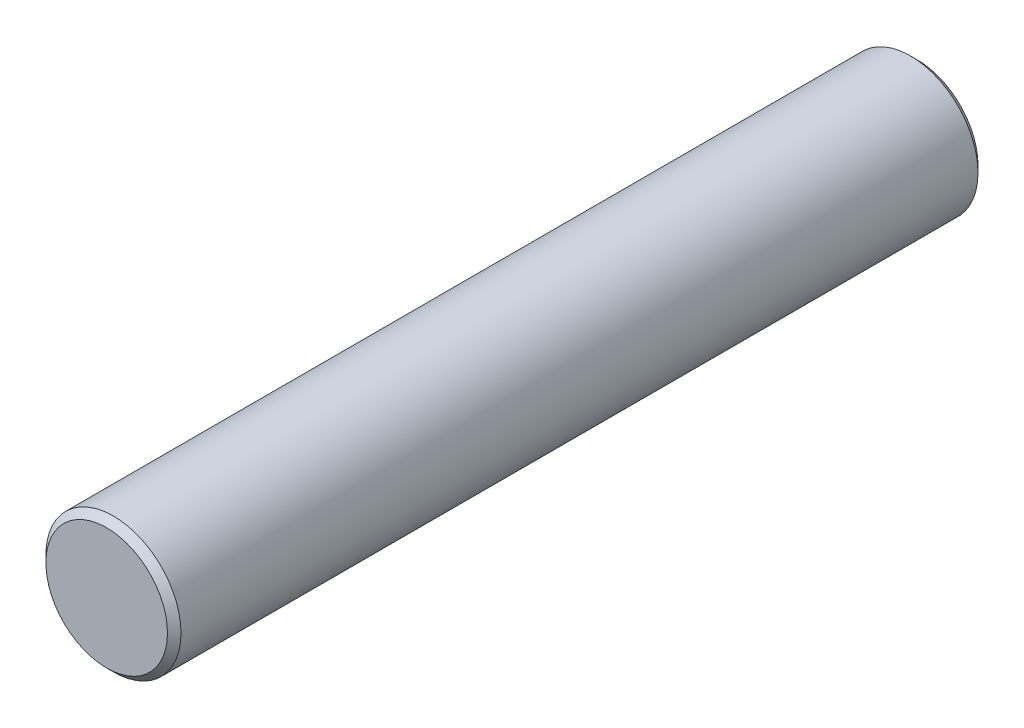
ISO-10303-21;
HEADER;
FILE_DESCRIPTION(('STEP AP214'),'2;1');
FILE_NAME('part.step','',(''),(''),'','','');
FILE_SCHEMA(('AUTOMOTIVE_DESIGN { 1 0 10303 214 1 1 1 1 }'));
ENDSEC;
DATA;
#1=APPLICATION_CONTEXT('core data for automotive mechanical design processes');
#2=APPLICATION_PROTOCOL_DEFINITION('international standard','automotive_design',2000,#1);
#3=PRODUCT_CONTEXT('',#1,'mechanical');
#4=PRODUCT('Part','Part','',(#3));
#5=PRODUCT_RELATED_PRODUCT_CATEGORY('part','',(#4));
#6=PRODUCT_DEFINITION_FORMATION('','',#4);
#7=PRODUCT_DEFINITION_CONTEXT('part definition',#1,'design');
#8=PRODUCT_DEFINITION('design','',#6,#7);
#9=PRODUCT_DEFINITION_SHAPE('','',#8);
#10=(LENGTH_UNIT() NAMED_UNIT(*) SI_UNIT(.MILLI.,.METRE.));
#11=(NAMED_UNIT(*) PLANE_ANGLE_UNIT() SI_UNIT($,.RADIAN.));
#12=(NAMED_UNIT(*) SI_UNIT($,.STERADIAN.) SOLID_ANGLE_UNIT());
#13=UNCERTAINTY_MEASURE_WITH_UNIT(LENGTH_MEASURE(1.E-05),#10,'distance_accuracy_value','');
#14=(GEOMETRIC_REPRESENTATION_CONTEXT(3) GLOBAL_UNCERTAINTY_ASSIGNED_CONTEXT((#13)) GLOBAL_UNIT_ASSIGNED_CONTEXT((#10,
#11,#12)) REPRESENTATION_CONTEXT('',''));
#15=CARTESIAN_POINT('',(0.,0.,0.));
#16=DIRECTION('',(0.,0.,1.));
#17=DIRECTION('',(1.,0.,0.));
#18=AXIS2_PLACEMENT_3D('',#15,#16,#17);
#19=CARTESIAN_POINT('',(0.,0.,60.));
#20=DIRECTION('',(0.,0.,-1.));
#21=DIRECTION('',(-1.,0.,0.));
#22=AXIS2_PLACEMENT_3D('',#19,#20,#21);
#23=CYLINDRICAL_SURFACE('',#22,5.);
#24=CARTESIAN_POINT('',(0.,0.,0.500000000000007));
#25=DIRECTION('',(0.,0.,1.));
#26=DIRECTION('',(1.,0.,0.));
#27=AXIS2_PLACEMENT_3D('',#24,#25,#26);
#28=CIRCLE('',#27,5.);
#29=CARTESIAN_POINT('',(5.,0.,0.500000000000007));
#30=VERTEX_POINT('',#29);
#31=EDGE_CURVE('E42',#30,#30,#28,.T.);
#32=ORIENTED_EDGE('',*,*,#31,.T.);
#33=EDGE_LOOP('',(#32));
#34=FACE_BOUND('',#33,.T.);
#35=CARTESIAN_POINT('',(0.,0.,59.5));
#36=DIRECTION('',(0.,0.,1.));
#37=DIRECTION('',(1.,0.,0.));
#38=AXIS2_PLACEMENT_3D('',#35,#36,#37);
#39=CIRCLE('',#38,5.);
#40=CARTESIAN_POINT('',(5.,0.,59.5));
#41=VERTEX_POINT('',#40);
#42=EDGE_CURVE('E46',#41,#41,#39,.F.);
#43=ORIENTED_EDGE('',*,*,#42,.T.);
#44=EDGE_LOOP('',(#43));
#45=FACE_BOUND('',#44,.T.);
#46=ADVANCED_FACE('F31',(#34,#45),#23,.T.);
#47=CARTESIAN_POINT('',(0.,0.,60.));
#48=DIRECTION('',(0.,0.,1.));
#49=DIRECTION('',(1.,0.,0.));
#50=AXIS2_PLACEMENT_3D('',#47,#48,#49);
#51=PLANE('',#50);
#52=CARTESIAN_POINT('',(0.,0.,60.));
#53=DIRECTION('',(0.,0.,1.));
#54=DIRECTION('',(1.,0.,0.));
#55=AXIS2_PLACEMENT_3D('',#52,#53,#54);
#56=CIRCLE('',#55,4.49999999999999);
#57=CARTESIAN_POINT('',(4.49999999999999,0.,60.));
#58=VERTEX_POINT('',#57);
#59=EDGE_CURVE('E10',#58,#58,#56,.T.);
#60=ORIENTED_EDGE('',*,*,#59,.T.);
#61=EDGE_LOOP('',(#60));
#62=FACE_BOUND('',#61,.T.);
#63=ADVANCED_FACE('F62',(#62),#51,.T.);
#64=CARTESIAN_POINT('',(0.,0.,0.));
#65=DIRECTION('',(0.,0.,1.));
#66=DIRECTION('',(1.,0.,0.));
#67=AXIS2_PLACEMENT_3D('',#64,#65,#66);
#68=PLANE('',#67);
#69=CARTESIAN_POINT('',(0.,0.,0.));
#70=DIRECTION('',(0.,0.,1.));
#71=DIRECTION('',(1.,0.,0.));
#72=AXIS2_PLACEMENT_3D('',#69,#70,#71);
#73=CIRCLE('',#72,4.5);
#74=CARTESIAN_POINT('',(4.5,0.,0.));
#75=VERTEX_POINT('',#74);
#76=EDGE_CURVE('E38',#75,#75,#73,.F.);
#77=ORIENTED_EDGE('',*,*,#76,.T.);
#78=EDGE_LOOP('',(#77));
#79=FACE_BOUND('',#78,.T.);
#80=ADVANCED_FACE('F59',(#79),#68,.F.);
#81=CARTESIAN_POINT('',(0.,0.,0.500000000000007));
#82=DIRECTION('',(0.,0.,1.));
#83=DIRECTION('',(1.,0.,0.));
#84=AXIS2_PLACEMENT_3D('',#81,#82,#83);
#85=CONICAL_SURFACE('',#84,5.,0.785398163397444);
#86=ORIENTED_EDGE('',*,*,#76,.F.);
#87=EDGE_LOOP('',(#86));
#88=FACE_BOUND('',#87,.T.);
#89=ORIENTED_EDGE('',*,*,#31,.F.);
#90=EDGE_LOOP('',(#89));
#91=FACE_BOUND('',#90,.T.);
#92=ADVANCED_FACE('F55',(#88,#91),#85,.T.);
#93=CARTESIAN_POINT('',(0.,0.,60.));
#94=DIRECTION('',(0.,0.,-1.));
#95=DIRECTION('',(-1.,0.,0.));
#96=AXIS2_PLACEMENT_3D('',#93,#94,#95);
#97=CONICAL_SURFACE('',#96,4.49999999999999,0.785398163397444);
#98=ORIENTED_EDGE('',*,*,#42,.F.);
#99=EDGE_LOOP('',(#98));
#100=FACE_BOUND('',#99,.T.);
#101=ORIENTED_EDGE('',*,*,#59,.F.);
#102=EDGE_LOOP('',(#101));
#103=FACE_BOUND('',#102,.T.);
#104=ADVANCED_FACE('F33',(#100,#103),#97,.T.);
#105=CLOSED_SHELL('',(#46,#63,#80,#92,#104));
#106=MANIFOLD_SOLID_BREP('B2',#105);
#107=ADVANCED_BREP_SHAPE_REPRESENTATION('',(#18,#106),#14);
#108=SHAPE_DEFINITION_REPRESENTATION(#9,#107);
ENDSEC;
END-ISO-10303-21;
